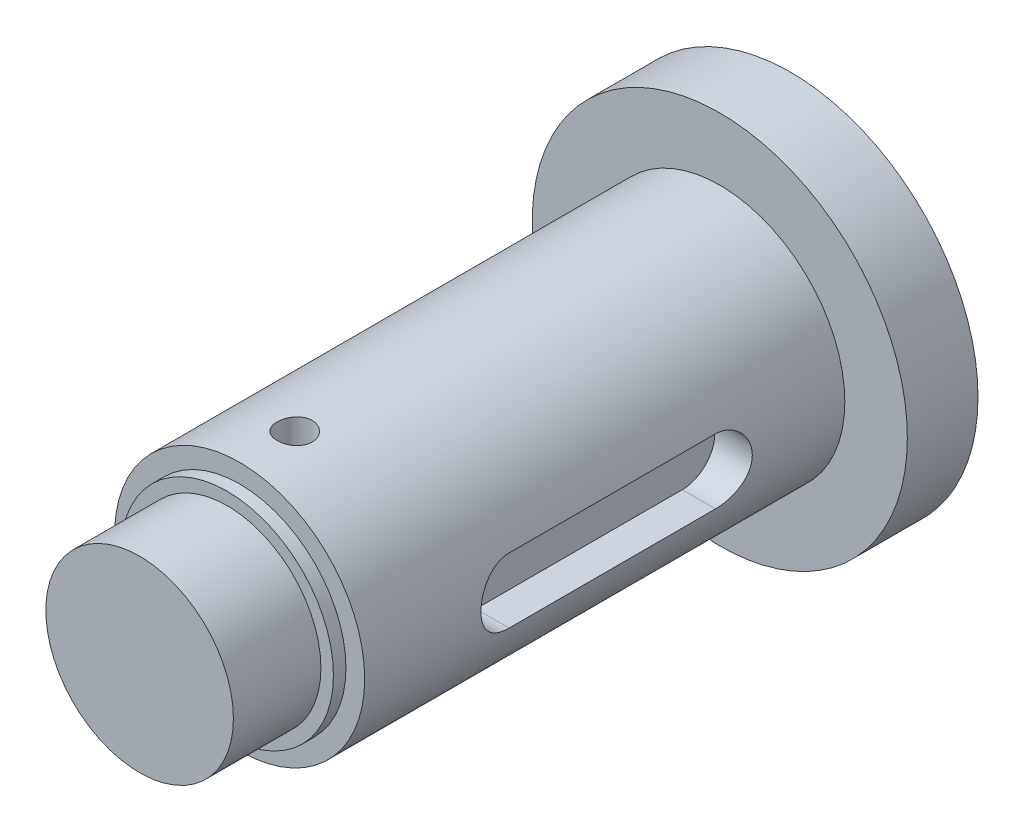
ISO-10303-21;
HEADER;
FILE_DESCRIPTION(('STEP AP214'),'2;1');
FILE_NAME('part.step','',(''),(''),'','','');
FILE_SCHEMA(('AUTOMOTIVE_DESIGN { 1 0 10303 214 1 1 1 1 }'));
ENDSEC;
DATA;
#1=APPLICATION_CONTEXT('core data for automotive mechanical design processes');
#2=APPLICATION_PROTOCOL_DEFINITION('international standard','automotive_design',2000,#1);
#3=PRODUCT_CONTEXT('',#1,'mechanical');
#4=PRODUCT('Part','Part','',(#3));
#5=PRODUCT_RELATED_PRODUCT_CATEGORY('part','',(#4));
#6=PRODUCT_DEFINITION_FORMATION('','',#4);
#7=PRODUCT_DEFINITION_CONTEXT('part definition',#1,'design');
#8=PRODUCT_DEFINITION('design','',#6,#7);
#9=PRODUCT_DEFINITION_SHAPE('','',#8);
#10=(LENGTH_UNIT() NAMED_UNIT(*) SI_UNIT(.MILLI.,.METRE.));
#11=(NAMED_UNIT(*) PLANE_ANGLE_UNIT() SI_UNIT($,.RADIAN.));
#12=(NAMED_UNIT(*) SI_UNIT($,.STERADIAN.) SOLID_ANGLE_UNIT());
#13=UNCERTAINTY_MEASURE_WITH_UNIT(LENGTH_MEASURE(1.E-05),#10,'distance_accuracy_value','');
#14=(GEOMETRIC_REPRESENTATION_CONTEXT(3) GLOBAL_UNCERTAINTY_ASSIGNED_CONTEXT((#13)) GLOBAL_UNIT_ASSIGNED_CONTEXT((#10,
#11,#12)) REPRESENTATION_CONTEXT('',''));
#15=CARTESIAN_POINT('',(0.,0.,0.));
#16=DIRECTION('',(0.,0.,1.));
#17=DIRECTION('',(1.,0.,0.));
#18=AXIS2_PLACEMENT_3D('',#15,#16,#17);
#19=CARTESIAN_POINT('',(0.,0.,52.05));
#20=DIRECTION('',(0.,0.,-1.));
#21=DIRECTION('',(-1.,0.,0.));
#22=AXIS2_PLACEMENT_3D('',#19,#20,#21);
#23=CYLINDRICAL_SURFACE('',#22,10.);
#24=DIRECTION('',(0.,0.,-1.));
#25=VECTOR('',#24,1.);
#26=CARTESIAN_POINT('',(9.65608616365865,2.6,52.05));
#27=LINE('',#26,#25);
#28=CARTESIAN_POINT('',(9.65608616365865,2.6,32.15));
#29=VERTEX_POINT('',#28);
#30=CARTESIAN_POINT('',(9.65608616365865,2.6,15.65));
#31=VERTEX_POINT('',#30);
#32=EDGE_CURVE('E12',#29,#31,#27,.T.);
#33=ORIENTED_EDGE('',*,*,#32,.T.);
#34=CARTESIAN_POINT('',(9.65608616365865,2.6,15.65));
#35=CARTESIAN_POINT('',(9.65607776116545,2.60000843713359,15.5781975938811));
#36=CARTESIAN_POINT('',(9.65688685581372,2.59702575768808,15.5064002680882));
#37=CARTESIAN_POINT('',(9.66007769749423,2.58514371613311,15.3633445183795));
#38=CARTESIAN_POINT('',(9.66245916368221,2.57624541062285,15.2920860005247));
#39=CARTESIAN_POINT('',(9.66872592839139,2.55262220019754,15.1507576253778));
#40=CARTESIAN_POINT('',(9.67260809090439,2.53790944432841,15.0806856053006));
#41=CARTESIAN_POINT('',(9.68175303350642,2.502795414013,14.9420929842449));
#42=CARTESIAN_POINT('',(9.68701583568773,2.48239404854018,14.8735724081109));
#43=CARTESIAN_POINT('',(9.70465344230895,2.4128857884052,14.6710715860874));
#44=CARTESIAN_POINT('',(9.71888453868422,2.35544960534249,14.5400033522125));
#45=CARTESIAN_POINT('',(9.75067933794044,2.22014679679086,14.2893858752232));
#46=CARTESIAN_POINT('',(9.76824405692455,2.14227393933435,14.1698401610205));
#47=CARTESIAN_POINT('',(9.80519230733242,1.96632578623943,13.942775825441));
#48=CARTESIAN_POINT('',(9.82460662938609,1.86785521124172,13.8355679195967));
#49=CARTESIAN_POINT('',(9.86280140617767,1.65435500934594,13.6389863331937));
#50=CARTESIAN_POINT('',(9.88158175827731,1.53932271686578,13.549615529024));
#51=CARTESIAN_POINT('',(9.91673595717615,1.29380600923544,13.3899502912469));
#52=CARTESIAN_POINT('',(9.93306898549242,1.16311369825143,13.3199657390177));
#53=CARTESIAN_POINT('',(9.96113275012234,0.891329613748766,13.2030830699437));
#54=CARTESIAN_POINT('',(9.97286444374598,0.750240010655682,13.1561801504361));
#55=CARTESIAN_POINT('',(9.99018586229863,0.464927755136858,13.0877959387717));
#56=CARTESIAN_POINT('',(9.99590401290213,0.320840629668431,13.0657823046617));
#57=CARTESIAN_POINT('',(10.0010025457774,0.0309094055580014,13.0461282671777));
#58=CARTESIAN_POINT('',(10.0003837995764,-0.114934448721529,13.0484845121614));
#59=CARTESIAN_POINT('',(9.99297271536516,-0.400532762511307,13.0771261172801));
#60=CARTESIAN_POINT('',(9.98632884668075,-0.540349369250033,13.1028360279346));
#61=CARTESIAN_POINT('',(9.96778837976824,-0.813609904968393,13.1765271315692));
#62=CARTESIAN_POINT('',(9.95589153890319,-0.94705353926225,13.2245093533217));
#63=CARTESIAN_POINT('',(9.92795868152069,-1.20527131339064,13.3418345934273));
#64=CARTESIAN_POINT('',(9.91188404743107,-1.32994999138199,13.4113781378747));
#65=CARTESIAN_POINT('',(9.87733287925366,-1.56606337919542,13.5696976257172));
#66=CARTESIAN_POINT('',(9.85885594876684,-1.67749589746836,13.6584767447582));
#67=CARTESIAN_POINT('',(9.82087161980764,-1.88737901498405,13.8558022060403));
#68=CARTESIAN_POINT('',(9.80134988204916,-1.98535709838161,13.9648488802344));
#69=CARTESIAN_POINT('',(9.76395984274706,-2.16176906222015,14.198059376369));
#70=CARTESIAN_POINT('',(9.74609199707937,-2.24019756407417,14.3222273446059));
#71=CARTESIAN_POINT('',(9.71397387267534,-2.37562703858085,14.5831611704823));
#72=CARTESIAN_POINT('',(9.69974647640212,-2.43249350703686,14.7199996893979));
#73=CARTESIAN_POINT('',(9.67681425109922,-2.52219056551544,15.0016765391418));
#74=CARTESIAN_POINT('',(9.66810114666097,-2.55505718405231,15.1465025261892));
#75=CARTESIAN_POINT('',(9.6604951211815,-2.58357968274523,15.3521687920168));
#76=CARTESIAN_POINT('',(9.65884450315455,-2.58973807284138,15.4116046951727));
#77=CARTESIAN_POINT('',(9.65664040424455,-2.59794376007734,15.5306841987168));
#78=CARTESIAN_POINT('',(9.65608517073955,-2.59999762455179,15.590327314113));
#79=CARTESIAN_POINT('',(9.65608616365865,-2.6,15.65));
#80=B_SPLINE_CURVE_WITH_KNOTS('',3,(#34,#35,#36,#37,#38,#39,#40,#41,#42,#43,#44,#45,#46,#47,#48,
#49,#50,#51,#52,#53,#54,#55,#56,#57,#58,#59,#60,#61,#62,#63,#64,#65,#66,#67,#68,#69,#70,#71,#72,
#73,#74,#75,#76,#77,#78,#79),.UNSPECIFIED.,.F.,.F.,(4,2,2,2,2,2,2,2,2,2,2,2,2,2,2,2,2,2,2,2,2,2,
4),(0.,0.215331996142847,0.430625541831113,0.645471599262171,0.86032109475841,1.28957229075595,
1.718954535187,2.15749018897729,2.59609650345126,3.0413549866598,3.48652078441666,
3.92197357665277,4.35736648091715,4.7823136947396,5.20728053910266,5.63632466355606,
6.06543967394651,6.50705030276173,6.94878229611854,7.39322617756538,7.83700148158659,
8.01620988278262,8.19513131613808),.UNSPECIFIED.);
#81=CARTESIAN_POINT('',(9.65608616365865,-2.6,15.65));
#82=VERTEX_POINT('',#81);
#83=EDGE_CURVE('E262',#31,#82,#80,.T.);
#84=ORIENTED_EDGE('',*,*,#83,.T.);
#85=DIRECTION('',(0.,0.,-1.));
#86=VECTOR('',#85,1.);
#87=CARTESIAN_POINT('',(9.65608616365865,-2.6,52.05));
#88=LINE('',#87,#86);
#89=CARTESIAN_POINT('',(9.65608616365865,-2.6,32.15));
#90=VERTEX_POINT('',#89);
#91=EDGE_CURVE('E50',#82,#90,#88,.F.);
#92=ORIENTED_EDGE('',*,*,#91,.T.);
#93=CARTESIAN_POINT('',(9.65608616365865,-2.6,32.15));
#94=CARTESIAN_POINT('',(9.65607776116545,-2.60000843713359,32.2218024061189));
#95=CARTESIAN_POINT('',(9.65688685581372,-2.59702575768808,32.2935997319118));
#96=CARTESIAN_POINT('',(9.66007769749423,-2.58514371613311,32.4366554816205));
#97=CARTESIAN_POINT('',(9.66245916368221,-2.57624541062285,32.5079139994753));
#98=CARTESIAN_POINT('',(9.66872592839139,-2.55262220019754,32.6492423746222));
#99=CARTESIAN_POINT('',(9.67260809090439,-2.53790944432842,32.7193143946994));
#100=CARTESIAN_POINT('',(9.68175303350642,-2.502795414013,32.8579070157551));
#101=CARTESIAN_POINT('',(9.68701583568773,-2.48239404854018,32.9264275918891));
#102=CARTESIAN_POINT('',(9.70465344230895,-2.4128857884052,33.1289284139126));
#103=CARTESIAN_POINT('',(9.71888453868422,-2.35544960534249,33.2599966477875));
#104=CARTESIAN_POINT('',(9.75067933794044,-2.22014679679086,33.5106141247768));
#105=CARTESIAN_POINT('',(9.76824405692455,-2.14227393933435,33.6301598389795));
#106=CARTESIAN_POINT('',(9.80519230733242,-1.96632578623944,33.857224174559));
#107=CARTESIAN_POINT('',(9.82460662938609,-1.86785521124172,33.9644320804033));
#108=CARTESIAN_POINT('',(9.86280140617767,-1.65435500934595,34.1610136668063));
#109=CARTESIAN_POINT('',(9.88158175827731,-1.53932271686578,34.250384470976));
#110=CARTESIAN_POINT('',(9.91673595717615,-1.29380600923545,34.4100497087531));
#111=CARTESIAN_POINT('',(9.93306898549242,-1.16311369825143,34.4800342609823));
#112=CARTESIAN_POINT('',(9.96113275012234,-0.891329613748769,34.5969169300563));
#113=CARTESIAN_POINT('',(9.97286444374598,-0.750240010655685,34.6438198495639));
#114=CARTESIAN_POINT('',(9.99018586229863,-0.464927755136862,34.7122040612283));
#115=CARTESIAN_POINT('',(9.99590401290213,-0.320840629668436,34.7342176953383));
#116=CARTESIAN_POINT('',(10.0010025457774,-0.0309094055580075,34.7538717328223));
#117=CARTESIAN_POINT('',(10.0003837995764,0.114934448721523,34.7515154878386));
#118=CARTESIAN_POINT('',(9.99297271536516,0.400532762511302,34.7228738827199));
#119=CARTESIAN_POINT('',(9.98632884668075,0.540349369250028,34.6971639720654));
#120=CARTESIAN_POINT('',(9.96778837976824,0.81360990496839,34.6234728684308));
#121=CARTESIAN_POINT('',(9.95589153890319,0.947053539262247,34.5754906466783));
#122=CARTESIAN_POINT('',(9.92795868152069,1.20527131339064,34.4581654065727));
#123=CARTESIAN_POINT('',(9.91188404743107,1.32994999138198,34.3886218621253));
#124=CARTESIAN_POINT('',(9.87733287925366,1.56606337919542,34.2303023742828));
#125=CARTESIAN_POINT('',(9.85885594876685,1.67749589746835,34.1415232552419));
#126=CARTESIAN_POINT('',(9.82087161980764,1.88737901498404,33.9441977939598));
#127=CARTESIAN_POINT('',(9.80134988204916,1.98535709838161,33.8351511197656));
#128=CARTESIAN_POINT('',(9.76395984274706,2.16176906222015,33.601940623631));
#129=CARTESIAN_POINT('',(9.74609199707937,2.24019756407416,33.4777726553941));
#130=CARTESIAN_POINT('',(9.71397387267533,2.37562703858085,33.2168388295177));
#131=CARTESIAN_POINT('',(9.69974647640212,2.43249350703686,33.0800003106021));
#132=CARTESIAN_POINT('',(9.67681425109922,2.52219056551544,32.7983234608582));
#133=CARTESIAN_POINT('',(9.66810114666097,2.55505718405231,32.6534974738108));
#134=CARTESIAN_POINT('',(9.6604951211815,2.58357968274523,32.4478312079832));
#135=CARTESIAN_POINT('',(9.65884450315455,2.58973807284138,32.3883953048273));
#136=CARTESIAN_POINT('',(9.65664040424455,2.59794376007734,32.2693158012832));
#137=CARTESIAN_POINT('',(9.65608517073955,2.59999762455179,32.209672685887));
#138=CARTESIAN_POINT('',(9.65608616365865,2.6,32.15));
#139=B_SPLINE_CURVE_WITH_KNOTS('',3,(#93,#94,#95,#96,#97,#98,#99,#100,#101,#102,#103,#104,#105,
#106,#107,#108,#109,#110,#111,#112,#113,#114,#115,#116,#117,#118,#119,#120,#121,#122,#123,#124,
#125,#126,#127,#128,#129,#130,#131,#132,#133,#134,#135,#136,#137,#138),.UNSPECIFIED.,.F.,.F.,(4,
2,2,2,2,2,2,2,2,2,2,2,2,2,2,2,2,2,2,2,2,2,4),(0.,0.215331996142842,0.430625541831116,
0.645471599262162,0.860321094758408,1.28957229075593,1.718954535187,2.15749018897729,
2.59609650345125,3.0413549866598,3.48652078441666,3.92197357665276,4.35736648091715,
4.78231369473959,5.20728053910265,5.63632466355606,6.0654396739465,6.50705030276173,
6.94878229611854,7.39322617756538,7.83700148158658,8.01620988278262,8.19513131613808),.UNSPECIFIED.);
#140=EDGE_CURVE('E57',#90,#29,#139,.T.);
#141=ORIENTED_EDGE('',*,*,#140,.T.);
#142=EDGE_LOOP('',(#33,#84,#92,#141));
#143=FACE_BOUND('',#142,.T.);
#144=CARTESIAN_POINT('',(0.,10.,41.05));
#145=CARTESIAN_POINT('',(-0.0782282971881736,9.99999880704253,41.0499967302927));
#146=CARTESIAN_POINT('',(-0.156503461724666,9.99907239830974,41.0434210899461));
#147=CARTESIAN_POINT('',(-0.310870001631005,9.9954659078926,41.0172965819832));
#148=CARTESIAN_POINT('',(-0.386959105753096,9.99278406658853,40.9977346968671));
#149=CARTESIAN_POINT('',(-0.534696857228105,9.98596840414154,40.9462301841225));
#150=CARTESIAN_POINT('',(-0.606348663725389,9.98183563030519,40.9142964849529));
#151=CARTESIAN_POINT('',(-0.743264435399572,9.97257602428289,40.8389757140463));
#152=CARTESIAN_POINT('',(-0.808529373042032,9.96744934378478,40.7955903896663));
#153=CARTESIAN_POINT('',(-0.93127741814965,9.95673376484668,40.6982812001441));
#154=CARTESIAN_POINT('',(-0.988710498897952,9.95114223163037,40.6442945137239));
#155=CARTESIAN_POINT('',(-1.09373320547751,9.94014802878934,40.5274501852534));
#156=CARTESIAN_POINT('',(-1.1413222933247,9.93474536950016,40.4645920586856));
#157=CARTESIAN_POINT('',(-1.2254974984927,9.92471494953013,40.3314574659997));
#158=CARTESIAN_POINT('',(-1.26203583392651,9.92009059124433,40.261150510967));
#159=CARTESIAN_POINT('',(-1.32276708626734,9.91217589223061,40.1153223701728));
#160=CARTESIAN_POINT('',(-1.34696058897521,9.90888548820393,40.0398014320242));
#161=CARTESIAN_POINT('',(-1.38216138600053,9.90403689130405,39.886212556105));
#162=CARTESIAN_POINT('',(-1.39325387196611,9.90246751199675,39.8081645027433));
#163=CARTESIAN_POINT('',(-1.40220155009301,9.901204596929,39.65130017466));
#164=CARTESIAN_POINT('',(-1.40005740590941,9.90151096712263,39.5724839386513));
#165=CARTESIAN_POINT('',(-1.38266243777218,9.90395470049609,39.4169189229665));
#166=CARTESIAN_POINT('',(-1.36750605461998,9.90607887001526,39.340159346168));
#167=CARTESIAN_POINT('',(-1.32466447511776,9.9118982681395,39.1902837431131));
#168=CARTESIAN_POINT('',(-1.29697896640554,9.91559353591331,39.1171678077464));
#169=CARTESIAN_POINT('',(-1.22976542329451,9.92415350790331,38.9763650924291));
#170=CARTESIAN_POINT('',(-1.19019695060766,9.9290221939642,38.9086978680594));
#171=CARTESIAN_POINT('',(-1.10036953501585,9.9393774692884,38.7809278974775));
#172=CARTESIAN_POINT('',(-1.05010997981793,9.94486409393343,38.720825584832));
#173=CARTESIAN_POINT('',(-0.939806577010343,9.95589549462252,38.6093438259227));
#174=CARTESIAN_POINT('',(-0.879681443997909,9.96144036144259,38.5580447806889));
#175=CARTESIAN_POINT('',(-0.751631847221704,9.97191903802371,38.4662538008708));
#176=CARTESIAN_POINT('',(-0.683707356784814,9.97685284569487,38.4257619032477));
#177=CARTESIAN_POINT('',(-0.541920722447886,9.98555772534513,38.3567322253912));
#178=CARTESIAN_POINT('',(-0.468055762281807,9.98932824168404,38.3282001553825));
#179=CARTESIAN_POINT('',(-0.316518429788033,9.99527691675257,38.2839673838347));
#180=CARTESIAN_POINT('',(-0.23884628169503,9.99745516914294,38.268265927562));
#181=CARTESIAN_POINT('',(-0.0825938477894293,9.9999615811838,38.2502458604143));
#182=CARTESIAN_POINT('',(-0.00402655624312811,10.0003050337974,38.2478166223964));
#183=CARTESIAN_POINT('',(0.152394144717367,9.99914463509872,38.2561170231146));
#184=CARTESIAN_POINT('',(0.230247573252181,9.99764083341115,38.26684630836));
#185=CARTESIAN_POINT('',(0.382699132210743,9.99296437014804,38.3010672292578));
#186=CARTESIAN_POINT('',(0.457309485151313,9.9897986949705,38.3245054509094));
#187=CARTESIAN_POINT('',(0.601541169765921,9.98215251897454,38.383422927658));
#188=CARTESIAN_POINT('',(0.67116229365305,9.97767196343473,38.4189026838974));
#189=CARTESIAN_POINT('',(0.803928908116784,9.96785651297204,38.5011590407096));
#190=CARTESIAN_POINT('',(0.86703016146963,9.96251634013149,38.5480064017085));
#191=CARTESIAN_POINT('',(0.984514153494672,9.95159382460353,38.6515689627042));
#192=CARTESIAN_POINT('',(1.03889645358971,9.9460114697519,38.7082846587949));
#193=CARTESIAN_POINT('',(1.13779715487912,9.93518580711721,38.8304642958588));
#194=CARTESIAN_POINT('',(1.18224173853561,9.92994522900697,38.8959882678782));
#195=CARTESIAN_POINT('',(1.25949361855926,9.92044339319114,39.033636438293));
#196=CARTESIAN_POINT('',(1.29230119646799,9.91618211179366,39.1057604769557));
#197=CARTESIAN_POINT('',(1.34523120682401,9.90914065473312,39.2543337369715));
#198=CARTESIAN_POINT('',(1.36539364982936,9.90635581183086,39.330768473532));
#199=CARTESIAN_POINT('',(1.39258907049338,9.90256973520278,39.4859807484061));
#200=CARTESIAN_POINT('',(1.39962282870021,9.90156839544136,39.564758147157));
#201=CARTESIAN_POINT('',(1.40034443203665,9.90146630506883,39.7216844147069));
#202=CARTESIAN_POINT('',(1.3941482942421,9.90234903246055,39.7998327642708));
#203=CARTESIAN_POINT('',(1.36883337163591,9.90587987183737,39.9539648933076));
#204=CARTESIAN_POINT('',(1.34971459743689,9.90852798237267,40.029948674558));
#205=CARTESIAN_POINT('',(1.29913617920527,9.91528571653348,40.1775696803371));
#206=CARTESIAN_POINT('',(1.26768359307711,9.91939450417525,40.2492093637104));
#207=CARTESIAN_POINT('',(1.19334180710319,9.92861179338548,40.3862134081857));
#208=CARTESIAN_POINT('',(1.15045232161689,9.93372031992192,40.4515776124999));
#209=CARTESIAN_POINT('',(1.05402880045864,9.94441498086101,40.5747663305622));
#210=CARTESIAN_POINT('',(1.00040857472563,9.95000475889879,40.6325230710027));
#211=CARTESIAN_POINT('',(0.884227351219559,9.96100092698614,40.7382611830066));
#212=CARTESIAN_POINT('',(0.821664267052114,9.96640727387546,40.7862402670607));
#213=CARTESIAN_POINT('',(0.689025225519357,9.9764565456144,40.8712621009555));
#214=CARTESIAN_POINT('',(0.618914862292061,9.98109570676177,40.9082516044359));
#215=CARTESIAN_POINT('',(0.473447613388806,9.98905061891876,40.9698764456326));
#216=CARTESIAN_POINT('',(0.398096371222681,9.99236776836323,40.994524844985));
#217=CARTESIAN_POINT('',(0.268653720963263,9.99652970400107,41.0250452226312));
#218=CARTESIAN_POINT('',(0.215369033513965,9.99782452761314,41.0343893266876));
#219=CARTESIAN_POINT('',(0.108063681641058,9.99956008335212,41.0468678133066));
#220=CARTESIAN_POINT('',(0.0540430246858426,10.0000008241395,41.0500022588357));
#221=CARTESIAN_POINT('',(0.,10.,41.05));
#222=B_SPLINE_CURVE_WITH_KNOTS('',3,(#144,#145,#146,#147,#148,#149,#150,#151,#152,#153,#154,
#155,#156,#157,#158,#159,#160,#161,#162,#163,#164,#165,#166,#167,#168,#169,#170,#171,#172,#173,
#174,#175,#176,#177,#178,#179,#180,#181,#182,#183,#184,#185,#186,#187,#188,#189,#190,#191,#192,
#193,#194,#195,#196,#197,#198,#199,#200,#201,#202,#203,#204,#205,#206,#207,#208,#209,#210,#211,
#212,#213,#214,#215,#216,#217,#218,#219,#220,#221),.UNSPECIFIED.,.T.,.F.,(4,2,2,2,2,2,2,2,2,2,2,
2,2,2,2,2,2,2,2,2,2,2,2,2,2,2,2,2,2,2,2,2,2,2,2,2,2,2,4),(0.,0.234487445699965,
0.469210298847026,0.703764072406697,0.938282077027584,1.17423416905447,1.41019915269479,
1.64717029041253,1.88413018206405,2.11954056518414,2.35493914544916,2.58864354479997,
2.82235377092959,3.05686851420482,3.29139669207855,3.52796437553467,3.76453286805565,
4.00121418200078,4.23788157266708,4.4725732392471,4.70725860120586,4.94096517128054,
5.1746814689058,5.40989169440529,5.64511374764217,5.8820289199644,6.11893836005413,
6.35509436054734,6.59123632025849,6.82531598707862,7.05939546166266,7.29334118154643,
7.52729274485311,7.76320483684767,7.99917205791182,8.23626460203056,8.47310567775886,
8.63509999149645,8.79709266258835),.UNSPECIFIED.);
#223=CARTESIAN_POINT('',(0.,10.,41.05));
#224=VERTEX_POINT('',#223);
#225=EDGE_CURVE('E158',#224,#224,#222,.T.);
#226=ORIENTED_EDGE('',*,*,#225,.T.);
#227=EDGE_LOOP('',(#226));
#228=FACE_BOUND('',#227,.T.);
#229=CARTESIAN_POINT('',(0.,0.,5.65));
#230=DIRECTION('',(0.,0.,1.));
#231=DIRECTION('',(1.,0.,0.));
#232=AXIS2_PLACEMENT_3D('',#229,#230,#231);
#233=CIRCLE('',#232,10.);
#234=CARTESIAN_POINT('',(10.,0.,5.65));
#235=VERTEX_POINT('',#234);
#236=EDGE_CURVE('E155',#235,#235,#233,.T.);
#237=ORIENTED_EDGE('',*,*,#236,.T.);
#238=EDGE_LOOP('',(#237));
#239=FACE_BOUND('',#238,.T.);
#240=CARTESIAN_POINT('',(0.,0.,44.05));
#241=DIRECTION('',(0.,0.,1.));
#242=DIRECTION('',(1.,0.,0.));
#243=AXIS2_PLACEMENT_3D('',#240,#241,#242);
#244=CIRCLE('',#243,10.);
#245=CARTESIAN_POINT('',(10.,0.,44.05));
#246=VERTEX_POINT('',#245);
#247=EDGE_CURVE('E121',#246,#246,#244,.T.);
#248=ORIENTED_EDGE('',*,*,#247,.F.);
#249=EDGE_LOOP('',(#248));
#250=FACE_BOUND('',#249,.T.);
#251=CARTESIAN_POINT('',(0.,-10.,38.25));
#252=CARTESIAN_POINT('',(0.0782282971881737,-9.99999880704253,38.2500032697073));
#253=CARTESIAN_POINT('',(0.156503461724666,-9.99907239830974,38.2565789100539));
#254=CARTESIAN_POINT('',(0.310870001631006,-9.9954659078926,38.2827034180168));
#255=CARTESIAN_POINT('',(0.386959105753097,-9.99278406658853,38.3022653031329));
#256=CARTESIAN_POINT('',(0.534696857228105,-9.98596840414154,38.3537698158775));
#257=CARTESIAN_POINT('',(0.606348663725388,-9.98183563030519,38.3857035150471));
#258=CARTESIAN_POINT('',(0.74326443539957,-9.97257602428289,38.4610242859537));
#259=CARTESIAN_POINT('',(0.808529373042031,-9.96744934378478,38.5044096103338));
#260=CARTESIAN_POINT('',(0.931277418149652,-9.95673376484668,38.6017187998559));
#261=CARTESIAN_POINT('',(0.988710498897955,-9.95114223163037,38.655705486276));
#262=CARTESIAN_POINT('',(1.09373320547752,-9.94014802878934,38.7725498147466));
#263=CARTESIAN_POINT('',(1.1413222933247,-9.93474536950016,38.8354079413144));
#264=CARTESIAN_POINT('',(1.22549749849271,-9.92471494953013,38.9685425340003));
#265=CARTESIAN_POINT('',(1.26203583392651,-9.92009059124433,39.038849489033));
#266=CARTESIAN_POINT('',(1.32276708626735,-9.91217589223061,39.1846776298272));
#267=CARTESIAN_POINT('',(1.34696058897522,-9.90888548820393,39.2601985679758));
#268=CARTESIAN_POINT('',(1.38216138600053,-9.90403689130405,39.413787443895));
#269=CARTESIAN_POINT('',(1.39325387196612,-9.90246751199675,39.4918354972567));
#270=CARTESIAN_POINT('',(1.40220155009302,-9.90120459692899,39.64869982534));
#271=CARTESIAN_POINT('',(1.40005740590942,-9.90151096712263,39.7275160613487));
#272=CARTESIAN_POINT('',(1.38266243777219,-9.90395470049609,39.8830810770335));
#273=CARTESIAN_POINT('',(1.36750605461999,-9.90607887001526,39.959840653832));
#274=CARTESIAN_POINT('',(1.32466447511778,-9.9118982681395,40.1097162568869));
#275=CARTESIAN_POINT('',(1.29697896640555,-9.91559353591331,40.1828321922536));
#276=CARTESIAN_POINT('',(1.22976542329453,-9.92415350790331,40.3236349075709));
#277=CARTESIAN_POINT('',(1.19019695060768,-9.92902219396419,40.3913021319406));
#278=CARTESIAN_POINT('',(1.10036953501587,-9.93937746928839,40.5190721025225));
#279=CARTESIAN_POINT('',(1.05010997981795,-9.94486409393343,40.579174415168));
#280=CARTESIAN_POINT('',(0.939806577010364,-9.95589549462252,40.6906561740773));
#281=CARTESIAN_POINT('',(0.879681443997931,-9.96144036144259,40.7419552193111));
#282=CARTESIAN_POINT('',(0.751631847221727,-9.97191903802371,40.8337461991292));
#283=CARTESIAN_POINT('',(0.683707356784837,-9.97685284569487,40.8742380967523));
#284=CARTESIAN_POINT('',(0.54192072244791,-9.98555772534513,40.9432677746088));
#285=CARTESIAN_POINT('',(0.468055762281831,-9.98932824168404,40.9717998446175));
#286=CARTESIAN_POINT('',(0.316518429788056,-9.99527691675257,41.0160326161653));
#287=CARTESIAN_POINT('',(0.238846281695052,-9.99745516914294,41.031734072438));
#288=CARTESIAN_POINT('',(0.0825938477894503,-9.9999615811838,41.0497541395857));
#289=CARTESIAN_POINT('',(0.00402655624314951,-10.0003050337974,41.0521833776036));
#290=CARTESIAN_POINT('',(-0.152394144717346,-9.99914463509872,41.0438829768854));
#291=CARTESIAN_POINT('',(-0.230247573252159,-9.99764083341115,41.03315369164));
#292=CARTESIAN_POINT('',(-0.382699132210721,-9.99296437014804,40.9989327707422));
#293=CARTESIAN_POINT('',(-0.457309485151291,-9.9897986949705,40.9754945490906));
#294=CARTESIAN_POINT('',(-0.601541169765899,-9.98215251897454,40.9165770723421));
#295=CARTESIAN_POINT('',(-0.671162293653028,-9.97767196343473,40.8810973161026));
#296=CARTESIAN_POINT('',(-0.803928908116761,-9.96785651297204,40.7988409592904));
#297=CARTESIAN_POINT('',(-0.867030161469606,-9.96251634013149,40.7519935982915));
#298=CARTESIAN_POINT('',(-0.984514153494649,-9.95159382460353,40.6484310372958));
#299=CARTESIAN_POINT('',(-1.03889645358969,-9.94601146975191,40.5917153412051));
#300=CARTESIAN_POINT('',(-1.1377971548791,-9.93518580711722,40.4695357041412));
#301=CARTESIAN_POINT('',(-1.1822417385356,-9.92994522900698,40.4040117321218));
#302=CARTESIAN_POINT('',(-1.25949361855924,-9.92044339319114,40.266363561707));
#303=CARTESIAN_POINT('',(-1.29230119646797,-9.91618211179367,40.1942395230444));
#304=CARTESIAN_POINT('',(-1.345231206824,-9.90914065473313,40.0456662630285));
#305=CARTESIAN_POINT('',(-1.36539364982935,-9.90635581183086,39.969231526468));
#306=CARTESIAN_POINT('',(-1.39258907049337,-9.90256973520278,39.8140192515939));
#307=CARTESIAN_POINT('',(-1.3996228287002,-9.90156839544136,39.735241852843));
#308=CARTESIAN_POINT('',(-1.40034443203664,-9.90146630506884,39.5783155852931));
#309=CARTESIAN_POINT('',(-1.39414829424209,-9.90234903246055,39.5001672357292));
#310=CARTESIAN_POINT('',(-1.3688333716359,-9.90587987183737,39.3460351066925));
#311=CARTESIAN_POINT('',(-1.34971459743688,-9.90852798237268,39.270051325442));
#312=CARTESIAN_POINT('',(-1.29913617920526,-9.91528571653348,39.1224303196629));
#313=CARTESIAN_POINT('',(-1.2676835930771,-9.91939450417525,39.0507906362896));
#314=CARTESIAN_POINT('',(-1.19334180710318,-9.92861179338548,38.9137865918143));
#315=CARTESIAN_POINT('',(-1.15045232161688,-9.93372031992192,38.8484223875001));
#316=CARTESIAN_POINT('',(-1.05402880045863,-9.94441498086101,38.7252336694378));
#317=CARTESIAN_POINT('',(-1.00040857472562,-9.95000475889879,38.6674769289973));
#318=CARTESIAN_POINT('',(-0.884227351219554,-9.96100092698614,38.5617388169935));
#319=CARTESIAN_POINT('',(-0.821664267052112,-9.96640727387546,38.5137597329393));
#320=CARTESIAN_POINT('',(-0.689025225519356,-9.9764565456144,38.4287378990445));
#321=CARTESIAN_POINT('',(-0.618914862292057,-9.98109570676177,38.3917483955642));
#322=CARTESIAN_POINT('',(-0.473447613388801,-9.98905061891876,38.3301235543674));
#323=CARTESIAN_POINT('',(-0.398096371222677,-9.99236776836323,38.305475155015));
#324=CARTESIAN_POINT('',(-0.26865372096326,-9.99652970400107,38.2749547773688));
#325=CARTESIAN_POINT('',(-0.215369033513961,-9.99782452761314,38.2656106733124));
#326=CARTESIAN_POINT('',(-0.108063681641056,-9.99956008335212,38.2531321866934));
#327=CARTESIAN_POINT('',(-0.0540430246858413,-10.0000008241395,38.2499977411643));
#328=CARTESIAN_POINT('',(0.,-10.,38.25));
#329=B_SPLINE_CURVE_WITH_KNOTS('',3,(#251,#252,#253,#254,#255,#256,#257,#258,#259,#260,#261,
#262,#263,#264,#265,#266,#267,#268,#269,#270,#271,#272,#273,#274,#275,#276,#277,#278,#279,#280,
#281,#282,#283,#284,#285,#286,#287,#288,#289,#290,#291,#292,#293,#294,#295,#296,#297,#298,#299,
#300,#301,#302,#303,#304,#305,#306,#307,#308,#309,#310,#311,#312,#313,#314,#315,#316,#317,#318,
#319,#320,#321,#322,#323,#324,#325,#326,#327,#328),.UNSPECIFIED.,.T.,.F.,(4,2,2,2,2,2,2,2,2,2,2,
2,2,2,2,2,2,2,2,2,2,2,2,2,2,2,2,2,2,2,2,2,2,2,2,2,2,2,4),(0.,0.234487445699966,
0.469210298847025,0.703764072406694,0.938282077027583,1.17423416905446,1.41019915269479,
1.64717029041253,1.88413018206405,2.11954056518414,2.35493914544916,2.58864354479997,
2.82235377092958,3.05686851420482,3.29139669207855,3.52796437553466,3.76453286805564,
4.00121418200077,4.23788157266709,4.4725732392471,4.70725860120586,4.94096517128053,
5.1746814689058,5.40989169440528,5.64511374764216,5.8820289199644,6.11893836005413,
6.35509436054734,6.59123632025849,6.82531598707862,7.05939546166267,7.29334118154646,
7.52729274485311,7.76320483684768,7.99917205791182,8.23626460203056,8.47310567775886,
8.63509999149645,8.79709266258835),.UNSPECIFIED.);
#330=CARTESIAN_POINT('',(0.,-10.,38.25));
#331=VERTEX_POINT('',#330);
#332=EDGE_CURVE('E173',#331,#331,#329,.T.);
#333=ORIENTED_EDGE('',*,*,#332,.F.);
#334=EDGE_LOOP('',(#333));
#335=FACE_BOUND('',#334,.T.);
#336=ADVANCED_FACE('F42',(#143,#228,#239,#250,#335),#23,.T.);
#337=CARTESIAN_POINT('',(0.,0.,5.65));
#338=DIRECTION('',(0.,0.,-1.));
#339=DIRECTION('',(-1.,0.,0.));
#340=AXIS2_PLACEMENT_3D('',#337,#338,#339);
#341=CYLINDRICAL_SURFACE('',#340,15.);
#342=CARTESIAN_POINT('',(0.,0.,5.65));
#343=DIRECTION('',(0.,0.,1.));
#344=DIRECTION('',(1.,0.,0.));
#345=AXIS2_PLACEMENT_3D('',#342,#343,#344);
#346=CIRCLE('',#345,15.);
#347=CARTESIAN_POINT('',(15.,0.,5.65));
#348=VERTEX_POINT('',#347);
#349=EDGE_CURVE('E159',#348,#348,#346,.T.);
#350=ORIENTED_EDGE('',*,*,#349,.F.);
#351=EDGE_LOOP('',(#350));
#352=FACE_BOUND('',#351,.T.);
#353=CARTESIAN_POINT('',(0.,0.,0.));
#354=DIRECTION('',(0.,0.,1.));
#355=DIRECTION('',(1.,0.,0.));
#356=AXIS2_PLACEMENT_3D('',#353,#354,#355);
#357=CIRCLE('',#356,15.);
#358=CARTESIAN_POINT('',(15.,0.,0.));
#359=VERTEX_POINT('',#358);
#360=EDGE_CURVE('E134',#359,#359,#357,.T.);
#361=ORIENTED_EDGE('',*,*,#360,.T.);
#362=EDGE_LOOP('',(#361));
#363=FACE_BOUND('',#362,.T.);
#364=ADVANCED_FACE('F44',(#352,#363),#341,.T.);
#365=CARTESIAN_POINT('',(0.,0.,5.65));
#366=DIRECTION('',(0.,0.,1.));
#367=DIRECTION('',(1.,0.,0.));
#368=AXIS2_PLACEMENT_3D('',#365,#366,#367);
#369=PLANE('',#368);
#370=ORIENTED_EDGE('',*,*,#236,.F.);
#371=EDGE_LOOP('',(#370));
#372=FACE_BOUND('',#371,.T.);
#373=ORIENTED_EDGE('',*,*,#349,.T.);
#374=EDGE_LOOP('',(#373));
#375=FACE_BOUND('',#374,.T.);
#376=ADVANCED_FACE('F249',(#372,#375),#369,.T.);
#377=CARTESIAN_POINT('',(0.,0.,0.));
#378=DIRECTION('',(0.,0.,1.));
#379=DIRECTION('',(1.,0.,0.));
#380=AXIS2_PLACEMENT_3D('',#377,#378,#379);
#381=PLANE('',#380);
#382=CARTESIAN_POINT('',(0.,7.,0.));
#383=DIRECTION('',(0.,0.,-1.));
#384=DIRECTION('',(-1.,0.,0.));
#385=AXIS2_PLACEMENT_3D('',#382,#383,#384);
#386=CIRCLE('',#385,1.25);
#387=CARTESIAN_POINT('',(-1.25,7.,0.));
#388=VERTEX_POINT('',#387);
#389=EDGE_CURVE('E135',#388,#388,#386,.T.);
#390=ORIENTED_EDGE('',*,*,#389,.F.);
#391=EDGE_LOOP('',(#390));
#392=FACE_BOUND('',#391,.T.);
#393=CARTESIAN_POINT('',(-7.0000000000002,1.97666086873723E-13,0.));
#394=DIRECTION('',(0.,0.,-1.));
#395=DIRECTION('',(-1.,0.,0.));
#396=AXIS2_PLACEMENT_3D('',#393,#394,#395);
#397=CIRCLE('',#396,1.25000000000015);
#398=CARTESIAN_POINT('',(-8.25000000000035,1.97666086873723E-13,0.));
#399=VERTEX_POINT('',#398);
#400=EDGE_CURVE('E138',#399,#399,#397,.T.);
#401=ORIENTED_EDGE('',*,*,#400,.F.);
#402=EDGE_LOOP('',(#401));
#403=FACE_BOUND('',#402,.T.);
#404=CARTESIAN_POINT('',(-3.95332173747447E-13,-7.,0.));
#405=DIRECTION('',(0.,0.,-1.));
#406=DIRECTION('',(-1.,0.,0.));
#407=AXIS2_PLACEMENT_3D('',#404,#405,#406);
#408=CIRCLE('',#407,1.25000000000042);
#409=CARTESIAN_POINT('',(-1.25000000000082,-7.,0.));
#410=VERTEX_POINT('',#409);
#411=EDGE_CURVE('E144',#410,#410,#408,.T.);
#412=ORIENTED_EDGE('',*,*,#411,.F.);
#413=EDGE_LOOP('',(#412));
#414=FACE_BOUND('',#413,.T.);
#415=CARTESIAN_POINT('',(6.9999999999998,-1.98523339633126E-13,0.));
#416=DIRECTION('',(0.,0.,-1.));
#417=DIRECTION('',(-1.,0.,0.));
#418=AXIS2_PLACEMENT_3D('',#415,#416,#417);
#419=CIRCLE('',#418,1.25000000000032);
#420=CARTESIAN_POINT('',(5.74999999999948,-1.98523339633126E-13,0.));
#421=VERTEX_POINT('',#420);
#422=EDGE_CURVE('E150',#421,#421,#419,.T.);
#423=ORIENTED_EDGE('',*,*,#422,.F.);
#424=EDGE_LOOP('',(#423));
#425=FACE_BOUND('',#424,.T.);
#426=ORIENTED_EDGE('',*,*,#360,.F.);
#427=EDGE_LOOP('',(#426));
#428=FACE_BOUND('',#427,.T.);
#429=ADVANCED_FACE('F234',(#392,#403,#414,#425,#428),#381,.F.);
#430=CARTESIAN_POINT('',(6.9999999999998,-1.98523339633126E-13,10.));
#431=DIRECTION('',(0.,0.,-1.));
#432=DIRECTION('',(-1.,0.,0.));
#433=AXIS2_PLACEMENT_3D('',#430,#431,#432);
#434=CYLINDRICAL_SURFACE('',#433,1.25000000000032);
#435=CARTESIAN_POINT('',(6.9999999999998,-1.98523339633126E-13,10.));
#436=DIRECTION('',(0.,0.,-1.));
#437=DIRECTION('',(-1.,0.,0.));
#438=AXIS2_PLACEMENT_3D('',#435,#436,#437);
#439=CIRCLE('',#438,1.25000000000032);
#440=CARTESIAN_POINT('',(5.74999999999948,-1.98523339633126E-13,10.));
#441=VERTEX_POINT('',#440);
#442=EDGE_CURVE('E127',#441,#441,#439,.T.);
#443=ORIENTED_EDGE('',*,*,#442,.F.);
#444=EDGE_LOOP('',(#443));
#445=FACE_BOUND('',#444,.T.);
#446=ORIENTED_EDGE('',*,*,#422,.T.);
#447=EDGE_LOOP('',(#446));
#448=FACE_BOUND('',#447,.T.);
#449=ADVANCED_FACE('F231',(#445,#448),#434,.F.);
#450=CARTESIAN_POINT('',(6.9999999999998,-1.98523339633126E-13,10.));
#451=DIRECTION('',(0.,0.,-1.));
#452=DIRECTION('',(-1.,0.,0.));
#453=AXIS2_PLACEMENT_3D('',#450,#451,#452);
#454=PLANE('',#453);
#455=ORIENTED_EDGE('',*,*,#442,.T.);
#456=EDGE_LOOP('',(#455));
#457=FACE_BOUND('',#456,.T.);
#458=ADVANCED_FACE('F226',(#457),#454,.T.);
#459=CARTESIAN_POINT('',(-3.95332173747447E-13,-7.,10.));
#460=DIRECTION('',(0.,0.,-1.));
#461=DIRECTION('',(-1.,0.,0.));
#462=AXIS2_PLACEMENT_3D('',#459,#460,#461);
#463=CYLINDRICAL_SURFACE('',#462,1.25000000000042);
#464=CARTESIAN_POINT('',(-3.95332173747447E-13,-7.,10.));
#465=DIRECTION('',(0.,0.,-1.));
#466=DIRECTION('',(-1.,0.,0.));
#467=AXIS2_PLACEMENT_3D('',#464,#465,#466);
#468=CIRCLE('',#467,1.25000000000042);
#469=CARTESIAN_POINT('',(-1.25000000000082,-7.,10.));
#470=VERTEX_POINT('',#469);
#471=EDGE_CURVE('E147',#470,#470,#468,.T.);
#472=ORIENTED_EDGE('',*,*,#471,.F.);
#473=EDGE_LOOP('',(#472));
#474=FACE_BOUND('',#473,.T.);
#475=ORIENTED_EDGE('',*,*,#411,.T.);
#476=EDGE_LOOP('',(#475));
#477=FACE_BOUND('',#476,.T.);
#478=ADVANCED_FACE('F223',(#474,#477),#463,.F.);
#479=CARTESIAN_POINT('',(-3.95332173747447E-13,-7.,10.));
#480=DIRECTION('',(0.,0.,-1.));
#481=DIRECTION('',(-1.,0.,0.));
#482=AXIS2_PLACEMENT_3D('',#479,#480,#481);
#483=PLANE('',#482);
#484=ORIENTED_EDGE('',*,*,#471,.T.);
#485=EDGE_LOOP('',(#484));
#486=FACE_BOUND('',#485,.T.);
#487=ADVANCED_FACE('F218',(#486),#483,.T.);
#488=CARTESIAN_POINT('',(-7.0000000000002,1.97666086873723E-13,10.));
#489=DIRECTION('',(0.,0.,-1.));
#490=DIRECTION('',(-1.,0.,0.));
#491=AXIS2_PLACEMENT_3D('',#488,#489,#490);
#492=CYLINDRICAL_SURFACE('',#491,1.25000000000015);
#493=CARTESIAN_POINT('',(-7.0000000000002,1.97666086873723E-13,10.));
#494=DIRECTION('',(0.,0.,-1.));
#495=DIRECTION('',(-1.,0.,0.));
#496=AXIS2_PLACEMENT_3D('',#493,#494,#495);
#497=CIRCLE('',#496,1.25000000000015);
#498=CARTESIAN_POINT('',(-8.25000000000035,1.97666086873723E-13,10.));
#499=VERTEX_POINT('',#498);
#500=EDGE_CURVE('E141',#499,#499,#497,.T.);
#501=ORIENTED_EDGE('',*,*,#500,.F.);
#502=EDGE_LOOP('',(#501));
#503=FACE_BOUND('',#502,.T.);
#504=ORIENTED_EDGE('',*,*,#400,.T.);
#505=EDGE_LOOP('',(#504));
#506=FACE_BOUND('',#505,.T.);
#507=ADVANCED_FACE('F215',(#503,#506),#492,.F.);
#508=CARTESIAN_POINT('',(-7.0000000000002,1.97666086873723E-13,10.));
#509=DIRECTION('',(0.,0.,-1.));
#510=DIRECTION('',(-1.,0.,0.));
#511=AXIS2_PLACEMENT_3D('',#508,#509,#510);
#512=PLANE('',#511);
#513=ORIENTED_EDGE('',*,*,#500,.T.);
#514=EDGE_LOOP('',(#513));
#515=FACE_BOUND('',#514,.T.);
#516=ADVANCED_FACE('F213',(#515),#512,.T.);
#517=CARTESIAN_POINT('',(0.,7.,10.));
#518=DIRECTION('',(0.,0.,-1.));
#519=DIRECTION('',(-1.,0.,0.));
#520=AXIS2_PLACEMENT_3D('',#517,#518,#519);
#521=CYLINDRICAL_SURFACE('',#520,1.25);
#522=CARTESIAN_POINT('',(0.,7.,10.));
#523=DIRECTION('',(0.,0.,-1.));
#524=DIRECTION('',(-1.,0.,0.));
#525=AXIS2_PLACEMENT_3D('',#522,#523,#524);
#526=CIRCLE('',#525,1.25);
#527=CARTESIAN_POINT('',(-1.25,7.,10.));
#528=VERTEX_POINT('',#527);
#529=EDGE_CURVE('E131',#528,#528,#526,.T.);
#530=ORIENTED_EDGE('',*,*,#529,.F.);
#531=EDGE_LOOP('',(#530));
#532=FACE_BOUND('',#531,.T.);
#533=ORIENTED_EDGE('',*,*,#389,.T.);
#534=EDGE_LOOP('',(#533));
#535=FACE_BOUND('',#534,.T.);
#536=ADVANCED_FACE('F209',(#532,#535),#521,.F.);
#537=CARTESIAN_POINT('',(0.,7.,10.));
#538=DIRECTION('',(0.,0.,-1.));
#539=DIRECTION('',(-1.,0.,0.));
#540=AXIS2_PLACEMENT_3D('',#537,#538,#539);
#541=PLANE('',#540);
#542=ORIENTED_EDGE('',*,*,#529,.T.);
#543=EDGE_LOOP('',(#542));
#544=FACE_BOUND('',#543,.T.);
#545=ADVANCED_FACE('F198',(#544),#541,.T.);
#546=CARTESIAN_POINT('',(0.,0.,44.05));
#547=DIRECTION('',(0.,0.,1.));
#548=DIRECTION('',(1.,0.,0.));
#549=AXIS2_PLACEMENT_3D('',#546,#547,#548);
#550=PLANE('',#549);
#551=CARTESIAN_POINT('',(0.,0.,44.05));
#552=DIRECTION('',(0.,0.,1.));
#553=DIRECTION('',(1.,0.,0.));
#554=AXIS2_PLACEMENT_3D('',#551,#552,#553);
#555=CIRCLE('',#554,8.5);
#556=CARTESIAN_POINT('',(8.5,0.,44.05));
#557=VERTEX_POINT('',#556);
#558=EDGE_CURVE('E118',#557,#557,#555,.T.);
#559=ORIENTED_EDGE('',*,*,#558,.F.);
#560=EDGE_LOOP('',(#559));
#561=FACE_BOUND('',#560,.T.);
#562=ORIENTED_EDGE('',*,*,#247,.T.);
#563=EDGE_LOOP('',(#562));
#564=FACE_BOUND('',#563,.T.);
#565=ADVANCED_FACE('F194',(#561,#564),#550,.T.);
#566=CARTESIAN_POINT('',(0.,0.,44.05));
#567=DIRECTION('',(0.,0.,1.));
#568=DIRECTION('',(1.,0.,0.));
#569=AXIS2_PLACEMENT_3D('',#566,#567,#568);
#570=CYLINDRICAL_SURFACE('',#569,8.5);
#571=ORIENTED_EDGE('',*,*,#558,.T.);
#572=EDGE_LOOP('',(#571));
#573=FACE_BOUND('',#572,.T.);
#574=CARTESIAN_POINT('',(0.,0.,45.05));
#575=DIRECTION('',(0.,0.,1.));
#576=DIRECTION('',(1.,0.,0.));
#577=AXIS2_PLACEMENT_3D('',#574,#575,#576);
#578=CIRCLE('',#577,8.5);
#579=CARTESIAN_POINT('',(8.5,0.,45.05));
#580=VERTEX_POINT('',#579);
#581=EDGE_CURVE('E117',#580,#580,#578,.T.);
#582=ORIENTED_EDGE('',*,*,#581,.F.);
#583=EDGE_LOOP('',(#582));
#584=FACE_BOUND('',#583,.T.);
#585=ADVANCED_FACE('F190',(#573,#584),#570,.T.);
#586=CARTESIAN_POINT('',(0.,0.,52.05));
#587=DIRECTION('',(0.,0.,1.));
#588=DIRECTION('',(1.,0.,0.));
#589=AXIS2_PLACEMENT_3D('',#586,#587,#588);
#590=PLANE('',#589);
#591=CARTESIAN_POINT('',(0.,0.,52.05));
#592=DIRECTION('',(0.,0.,1.));
#593=DIRECTION('',(1.,0.,0.));
#594=AXIS2_PLACEMENT_3D('',#591,#592,#593);
#595=CIRCLE('',#594,7.5);
#596=CARTESIAN_POINT('',(7.5,0.,52.05));
#597=VERTEX_POINT('',#596);
#598=EDGE_CURVE('E128',#597,#597,#595,.T.);
#599=ORIENTED_EDGE('',*,*,#598,.T.);
#600=EDGE_LOOP('',(#599));
#601=FACE_BOUND('',#600,.T.);
#602=ADVANCED_FACE('F193',(#601),#590,.T.);
#603=CARTESIAN_POINT('',(0.,0.,45.05));
#604=DIRECTION('',(0.,0.,1.));
#605=DIRECTION('',(1.,0.,0.));
#606=AXIS2_PLACEMENT_3D('',#603,#604,#605);
#607=CYLINDRICAL_SURFACE('',#606,7.5);
#608=CARTESIAN_POINT('',(0.,0.,45.05));
#609=DIRECTION('',(0.,0.,1.));
#610=DIRECTION('',(1.,0.,0.));
#611=AXIS2_PLACEMENT_3D('',#608,#609,#610);
#612=CIRCLE('',#611,7.5);
#613=CARTESIAN_POINT('',(7.5,0.,45.05));
#614=VERTEX_POINT('',#613);
#615=EDGE_CURVE('E124',#614,#614,#612,.T.);
#616=ORIENTED_EDGE('',*,*,#615,.T.);
#617=EDGE_LOOP('',(#616));
#618=FACE_BOUND('',#617,.T.);
#619=ORIENTED_EDGE('',*,*,#598,.F.);
#620=EDGE_LOOP('',(#619));
#621=FACE_BOUND('',#620,.T.);
#622=ADVANCED_FACE('F200',(#618,#621),#607,.T.);
#623=CARTESIAN_POINT('',(0.,0.,45.05));
#624=DIRECTION('',(0.,0.,1.));
#625=DIRECTION('',(1.,0.,0.));
#626=AXIS2_PLACEMENT_3D('',#623,#624,#625);
#627=PLANE('',#626);
#628=ORIENTED_EDGE('',*,*,#615,.F.);
#629=EDGE_LOOP('',(#628));
#630=FACE_BOUND('',#629,.T.);
#631=ORIENTED_EDGE('',*,*,#581,.T.);
#632=EDGE_LOOP('',(#631));
#633=FACE_BOUND('',#632,.T.);
#634=ADVANCED_FACE('F188',(#630,#633),#627,.T.);
#635=CARTESIAN_POINT('',(0.,2.,39.65));
#636=DIRECTION('',(0.,1.,0.));
#637=DIRECTION('',(0.,0.,1.));
#638=AXIS2_PLACEMENT_3D('',#635,#636,#637);
#639=CYLINDRICAL_SURFACE('',#638,1.4);
#640=CARTESIAN_POINT('',(0.,2.,39.65));
#641=DIRECTION('',(0.,1.,0.));
#642=DIRECTION('',(0.,0.,1.));
#643=AXIS2_PLACEMENT_3D('',#640,#641,#642);
#644=CIRCLE('',#643,1.4);
#645=CARTESIAN_POINT('',(0.,2.,41.05));
#646=VERTEX_POINT('',#645);
#647=EDGE_CURVE('E114',#646,#646,#644,.T.);
#648=ORIENTED_EDGE('',*,*,#647,.F.);
#649=EDGE_LOOP('',(#648));
#650=FACE_BOUND('',#649,.T.);
#651=ORIENTED_EDGE('',*,*,#225,.F.);
#652=EDGE_LOOP('',(#651));
#653=FACE_BOUND('',#652,.T.);
#654=ADVANCED_FACE('F182',(#650,#653),#639,.F.);
#655=CARTESIAN_POINT('',(0.,2.,39.65));
#656=DIRECTION('',(0.,1.,0.));
#657=DIRECTION('',(0.,0.,1.));
#658=AXIS2_PLACEMENT_3D('',#655,#656,#657);
#659=PLANE('',#658);
#660=ORIENTED_EDGE('',*,*,#647,.T.);
#661=EDGE_LOOP('',(#660));
#662=FACE_BOUND('',#661,.T.);
#663=ADVANCED_FACE('F187',(#662),#659,.T.);
#664=CARTESIAN_POINT('',(0.,-2.,39.65));
#665=DIRECTION('',(0.,-1.,0.));
#666=DIRECTION('',(0.,0.,-1.));
#667=AXIS2_PLACEMENT_3D('',#664,#665,#666);
#668=CYLINDRICAL_SURFACE('',#667,1.4);
#669=CARTESIAN_POINT('',(0.,-2.,39.65));
#670=DIRECTION('',(0.,1.,0.));
#671=DIRECTION('',(0.,0.,1.));
#672=AXIS2_PLACEMENT_3D('',#669,#670,#671);
#673=CIRCLE('',#672,1.4);
#674=CARTESIAN_POINT('',(0.,-2.,41.05));
#675=VERTEX_POINT('',#674);
#676=EDGE_CURVE('E108',#675,#675,#673,.T.);
#677=ORIENTED_EDGE('',*,*,#676,.T.);
#678=EDGE_LOOP('',(#677));
#679=FACE_BOUND('',#678,.T.);
#680=ORIENTED_EDGE('',*,*,#332,.T.);
#681=EDGE_LOOP('',(#680));
#682=FACE_BOUND('',#681,.T.);
#683=ADVANCED_FACE('F288',(#679,#682),#668,.F.);
#684=CARTESIAN_POINT('',(0.,-2.,39.65));
#685=DIRECTION('',(0.,-1.,0.));
#686=DIRECTION('',(0.,0.,1.));
#687=AXIS2_PLACEMENT_3D('',#684,#685,#686);
#688=PLANE('',#687);
#689=ORIENTED_EDGE('',*,*,#676,.F.);
#690=EDGE_LOOP('',(#689));
#691=FACE_BOUND('',#690,.T.);
#692=ADVANCED_FACE('F286',(#691),#688,.T.);
#693=CARTESIAN_POINT('',(7.,0.,32.15));
#694=DIRECTION('',(1.,0.,0.));
#695=DIRECTION('',(0.,0.,-1.));
#696=AXIS2_PLACEMENT_3D('',#693,#694,#695);
#697=CYLINDRICAL_SURFACE('',#696,2.6);
#698=DIRECTION('',(1.,0.,0.));
#699=VECTOR('',#698,1.);
#700=CARTESIAN_POINT('',(7.,-2.6,32.15));
#701=LINE('',#700,#699);
#702=CARTESIAN_POINT('',(7.,-2.6,32.15));
#703=VERTEX_POINT('',#702);
#704=EDGE_CURVE('E80',#703,#90,#701,.T.);
#705=ORIENTED_EDGE('',*,*,#704,.F.);
#706=CARTESIAN_POINT('',(7.,0.,32.15));
#707=DIRECTION('',(1.,0.,0.));
#708=DIRECTION('',(0.,0.,-1.));
#709=AXIS2_PLACEMENT_3D('',#706,#707,#708);
#710=CIRCLE('',#709,2.6);
#711=CARTESIAN_POINT('',(7.,2.6,32.15));
#712=VERTEX_POINT('',#711);
#713=EDGE_CURVE('E84',#712,#703,#710,.T.);
#714=ORIENTED_EDGE('',*,*,#713,.F.);
#715=DIRECTION('',(1.,0.,0.));
#716=VECTOR('',#715,1.);
#717=CARTESIAN_POINT('',(7.,2.6,32.15));
#718=LINE('',#717,#716);
#719=EDGE_CURVE('E106',#712,#29,#718,.T.);
#720=ORIENTED_EDGE('',*,*,#719,.T.);
#721=ORIENTED_EDGE('',*,*,#140,.F.);
#722=EDGE_LOOP('',(#705,#714,#720,#721));
#723=FACE_BOUND('',#722,.T.);
#724=ADVANCED_FACE('F82',(#723),#697,.F.);
#725=CARTESIAN_POINT('',(7.,2.6,32.15));
#726=DIRECTION('',(0.,1.,0.));
#727=DIRECTION('',(0.,0.,1.));
#728=AXIS2_PLACEMENT_3D('',#725,#726,#727);
#729=PLANE('',#728);
#730=ORIENTED_EDGE('',*,*,#719,.F.);
#731=DIRECTION('',(0.,0.,1.));
#732=VECTOR('',#731,1.);
#733=CARTESIAN_POINT('',(7.,2.6,32.15));
#734=LINE('',#733,#732);
#735=CARTESIAN_POINT('',(7.,2.6,15.65));
#736=VERTEX_POINT('',#735);
#737=EDGE_CURVE('E89',#736,#712,#734,.T.);
#738=ORIENTED_EDGE('',*,*,#737,.F.);
#739=DIRECTION('',(1.,0.,0.));
#740=VECTOR('',#739,1.);
#741=CARTESIAN_POINT('',(7.,2.6,15.65));
#742=LINE('',#741,#740);
#743=EDGE_CURVE('E109',#736,#31,#742,.T.);
#744=ORIENTED_EDGE('',*,*,#743,.T.);
#745=ORIENTED_EDGE('',*,*,#32,.F.);
#746=EDGE_LOOP('',(#730,#738,#744,#745));
#747=FACE_BOUND('',#746,.T.);
#748=ADVANCED_FACE('F279',(#747),#729,.F.);
#749=CARTESIAN_POINT('',(7.,0.,15.65));
#750=DIRECTION('',(1.,0.,0.));
#751=DIRECTION('',(0.,0.,-1.));
#752=AXIS2_PLACEMENT_3D('',#749,#750,#751);
#753=CYLINDRICAL_SURFACE('',#752,2.6);
#754=ORIENTED_EDGE('',*,*,#743,.F.);
#755=CARTESIAN_POINT('',(7.,0.,15.65));
#756=DIRECTION('',(1.,0.,0.));
#757=DIRECTION('',(0.,0.,-1.));
#758=AXIS2_PLACEMENT_3D('',#755,#756,#757);
#759=CIRCLE('',#758,2.6);
#760=CARTESIAN_POINT('',(7.,-2.6,15.65));
#761=VERTEX_POINT('',#760);
#762=EDGE_CURVE('E98',#761,#736,#759,.T.);
#763=ORIENTED_EDGE('',*,*,#762,.F.);
#764=DIRECTION('',(1.,0.,0.));
#765=VECTOR('',#764,1.);
#766=CARTESIAN_POINT('',(7.,-2.6,15.65));
#767=LINE('',#766,#765);
#768=EDGE_CURVE('E88',#761,#82,#767,.T.);
#769=ORIENTED_EDGE('',*,*,#768,.T.);
#770=ORIENTED_EDGE('',*,*,#83,.F.);
#771=EDGE_LOOP('',(#754,#763,#769,#770));
#772=FACE_BOUND('',#771,.T.);
#773=ADVANCED_FACE('F274',(#772),#753,.F.);
#774=CARTESIAN_POINT('',(7.,-2.6,32.15));
#775=DIRECTION('',(0.,-1.,0.));
#776=DIRECTION('',(0.,0.,-1.));
#777=AXIS2_PLACEMENT_3D('',#774,#775,#776);
#778=PLANE('',#777);
#779=ORIENTED_EDGE('',*,*,#768,.F.);
#780=DIRECTION('',(0.,0.,-1.));
#781=VECTOR('',#780,1.);
#782=CARTESIAN_POINT('',(7.,-2.6,32.15));
#783=LINE('',#782,#781);
#784=EDGE_CURVE('E92',#703,#761,#783,.T.);
#785=ORIENTED_EDGE('',*,*,#784,.F.);
#786=ORIENTED_EDGE('',*,*,#704,.T.);
#787=ORIENTED_EDGE('',*,*,#91,.F.);
#788=EDGE_LOOP('',(#779,#785,#786,#787));
#789=FACE_BOUND('',#788,.T.);
#790=ADVANCED_FACE('F93',(#789),#778,.F.);
#791=CARTESIAN_POINT('',(7.,0.,32.15));
#792=DIRECTION('',(1.,0.,0.));
#793=DIRECTION('',(0.,0.,-1.));
#794=AXIS2_PLACEMENT_3D('',#791,#792,#793);
#795=PLANE('',#794);
#796=ORIENTED_EDGE('',*,*,#713,.T.);
#797=ORIENTED_EDGE('',*,*,#784,.T.);
#798=ORIENTED_EDGE('',*,*,#762,.T.);
#799=ORIENTED_EDGE('',*,*,#737,.T.);
#800=EDGE_LOOP('',(#796,#797,#798,#799));
#801=FACE_BOUND('',#800,.T.);
#802=ADVANCED_FACE('F100',(#801),#795,.T.);
#803=CLOSED_SHELL('',(#336,#364,#376,#429,#449,#458,#478,#487,#507,#516,#536,#545,#565,#585,
#602,#622,#634,#654,#663,#683,#692,#724,#748,#773,#790,#802));
#804=MANIFOLD_SOLID_BREP('B2',#803);
#805=ADVANCED_BREP_SHAPE_REPRESENTATION('',(#18,#804),#14);
#806=SHAPE_DEFINITION_REPRESENTATION(#9,#805);
ENDSEC;
END-ISO-10303-21;
